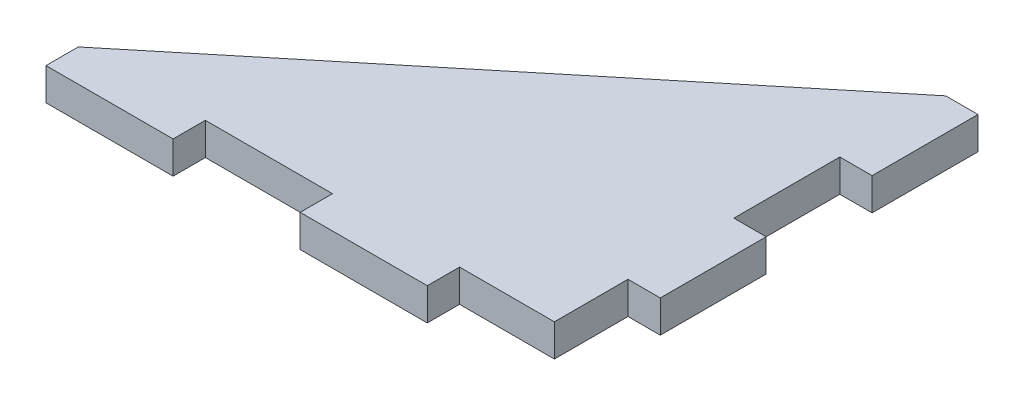
ISO-10303-21;
HEADER;
FILE_DESCRIPTION(('STEP AP214'),'2;1');
FILE_NAME('part.step','',(''),(''),'','','');
FILE_SCHEMA(('AUTOMOTIVE_DESIGN { 1 0 10303 214 1 1 1 1 }'));
ENDSEC;
DATA;
#1=APPLICATION_CONTEXT('core data for automotive mechanical design processes');
#2=APPLICATION_PROTOCOL_DEFINITION('international standard','automotive_design',2000,#1);
#3=PRODUCT_CONTEXT('',#1,'mechanical');
#4=PRODUCT('Part','Part','',(#3));
#5=PRODUCT_RELATED_PRODUCT_CATEGORY('part','',(#4));
#6=PRODUCT_DEFINITION_FORMATION('','',#4);
#7=PRODUCT_DEFINITION_CONTEXT('part definition',#1,'design');
#8=PRODUCT_DEFINITION('design','',#6,#7);
#9=PRODUCT_DEFINITION_SHAPE('','',#8);
#10=(LENGTH_UNIT() NAMED_UNIT(*) SI_UNIT(.MILLI.,.METRE.));
#11=(NAMED_UNIT(*) PLANE_ANGLE_UNIT() SI_UNIT($,.RADIAN.));
#12=(NAMED_UNIT(*) SI_UNIT($,.STERADIAN.) SOLID_ANGLE_UNIT());
#13=UNCERTAINTY_MEASURE_WITH_UNIT(LENGTH_MEASURE(1.E-05),#10,'distance_accuracy_value','');
#14=(GEOMETRIC_REPRESENTATION_CONTEXT(3) GLOBAL_UNCERTAINTY_ASSIGNED_CONTEXT((#13)) GLOBAL_UNIT_ASSIGNED_CONTEXT((#10,
#11,#12)) REPRESENTATION_CONTEXT('',''));
#15=CARTESIAN_POINT('',(0.,0.,0.));
#16=DIRECTION('',(0.,0.,1.));
#17=DIRECTION('',(1.,0.,0.));
#18=AXIS2_PLACEMENT_3D('',#15,#16,#17);
#19=CARTESIAN_POINT('',(0.,6.096,0.));
#20=DIRECTION('',(1.,0.,0.));
#21=DIRECTION('',(0.,0.,-1.));
#22=AXIS2_PLACEMENT_3D('',#19,#20,#21);
#23=PLANE('',#22);
#24=DIRECTION('',(0.,0.,1.));
#25=VECTOR('',#24,1.);
#26=CARTESIAN_POINT('',(0.,0.,0.));
#27=LINE('',#26,#25);
#28=CARTESIAN_POINT('',(0.,0.,-6.096));
#29=VERTEX_POINT('',#28);
#30=CARTESIAN_POINT('',(0.,0.,0.));
#31=VERTEX_POINT('',#30);
#32=EDGE_CURVE('E182',#29,#31,#27,.T.);
#33=ORIENTED_EDGE('',*,*,#32,.T.);
#34=DIRECTION('',(0.,-1.,0.));
#35=VECTOR('',#34,1.);
#36=CARTESIAN_POINT('',(0.,6.096,0.));
#37=LINE('',#36,#35);
#38=CARTESIAN_POINT('',(0.,6.096,0.));
#39=VERTEX_POINT('',#38);
#40=EDGE_CURVE('E11',#39,#31,#37,.T.);
#41=ORIENTED_EDGE('',*,*,#40,.F.);
#42=DIRECTION('',(0.,0.,1.));
#43=VECTOR('',#42,1.);
#44=CARTESIAN_POINT('',(0.,6.096,0.));
#45=LINE('',#44,#43);
#46=CARTESIAN_POINT('',(0.,6.096,-6.096));
#47=VERTEX_POINT('',#46);
#48=EDGE_CURVE('E214',#47,#39,#45,.T.);
#49=ORIENTED_EDGE('',*,*,#48,.F.);
#50=DIRECTION('',(0.,-1.,0.));
#51=VECTOR('',#50,1.);
#52=CARTESIAN_POINT('',(0.,6.096,-6.096));
#53=LINE('',#52,#51);
#54=EDGE_CURVE('E178',#47,#29,#53,.T.);
#55=ORIENTED_EDGE('',*,*,#54,.T.);
#56=EDGE_LOOP('',(#33,#41,#49,#55));
#57=FACE_BOUND('',#56,.T.);
#58=ADVANCED_FACE('F32',(#57),#23,.F.);
#59=CARTESIAN_POINT('',(0.,6.096,0.));
#60=DIRECTION('',(0.,0.,-1.));
#61=DIRECTION('',(-1.,0.,0.));
#62=AXIS2_PLACEMENT_3D('',#59,#60,#61);
#63=PLANE('',#62);
#64=DIRECTION('',(1.,0.,0.));
#65=VECTOR('',#64,1.);
#66=CARTESIAN_POINT('',(0.,0.,0.));
#67=LINE('',#66,#65);
#68=CARTESIAN_POINT('',(24.,0.,0.));
#69=VERTEX_POINT('',#68);
#70=EDGE_CURVE('E185',#31,#69,#67,.T.);
#71=ORIENTED_EDGE('',*,*,#70,.T.);
#72=DIRECTION('',(0.,-1.,0.));
#73=VECTOR('',#72,1.);
#74=CARTESIAN_POINT('',(24.,6.096,0.));
#75=LINE('',#74,#73);
#76=CARTESIAN_POINT('',(24.,6.096,0.));
#77=VERTEX_POINT('',#76);
#78=EDGE_CURVE('E40',#77,#69,#75,.T.);
#79=ORIENTED_EDGE('',*,*,#78,.F.);
#80=DIRECTION('',(1.,0.,0.));
#81=VECTOR('',#80,1.);
#82=CARTESIAN_POINT('',(0.,6.096,0.));
#83=LINE('',#82,#81);
#84=EDGE_CURVE('E118',#39,#77,#83,.T.);
#85=ORIENTED_EDGE('',*,*,#84,.F.);
#86=ORIENTED_EDGE('',*,*,#40,.T.);
#87=EDGE_LOOP('',(#71,#79,#85,#86));
#88=FACE_BOUND('',#87,.T.);
#89=ADVANCED_FACE('F317',(#88),#63,.F.);
#90=CARTESIAN_POINT('',(24.,6.096,0.));
#91=DIRECTION('',(-1.,0.,0.));
#92=DIRECTION('',(0.,0.,1.));
#93=AXIS2_PLACEMENT_3D('',#90,#91,#92);
#94=PLANE('',#93);
#95=DIRECTION('',(0.,0.,-1.));
#96=VECTOR('',#95,1.);
#97=CARTESIAN_POINT('',(24.,0.,0.));
#98=LINE('',#97,#96);
#99=CARTESIAN_POINT('',(24.,0.,-6.09600000000001));
#100=VERTEX_POINT('',#99);
#101=EDGE_CURVE('E187',#69,#100,#98,.T.);
#102=ORIENTED_EDGE('',*,*,#101,.T.);
#103=DIRECTION('',(0.,-1.,0.));
#104=VECTOR('',#103,1.);
#105=CARTESIAN_POINT('',(24.,6.096,-6.09600000000001));
#106=LINE('',#105,#104);
#107=CARTESIAN_POINT('',(24.,6.096,-6.09600000000001));
#108=VERTEX_POINT('',#107);
#109=EDGE_CURVE('E248',#108,#100,#106,.T.);
#110=ORIENTED_EDGE('',*,*,#109,.F.);
#111=DIRECTION('',(0.,0.,-1.));
#112=VECTOR('',#111,1.);
#113=CARTESIAN_POINT('',(24.,6.096,0.));
#114=LINE('',#113,#112);
#115=EDGE_CURVE('E256',#77,#108,#114,.T.);
#116=ORIENTED_EDGE('',*,*,#115,.F.);
#117=ORIENTED_EDGE('',*,*,#78,.T.);
#118=EDGE_LOOP('',(#102,#110,#116,#117));
#119=FACE_BOUND('',#118,.T.);
#120=ADVANCED_FACE('F254',(#119),#94,.F.);
#121=CARTESIAN_POINT('',(24.,6.096,-6.09600000000001));
#122=DIRECTION('',(0.,0.,-1.));
#123=DIRECTION('',(-1.,0.,0.));
#124=AXIS2_PLACEMENT_3D('',#121,#122,#123);
#125=PLANE('',#124);
#126=DIRECTION('',(1.,0.,0.));
#127=VECTOR('',#126,1.);
#128=CARTESIAN_POINT('',(24.,0.,-6.09600000000001));
#129=LINE('',#128,#127);
#130=CARTESIAN_POINT('',(48.,0.,-6.09600000000001));
#131=VERTEX_POINT('',#130);
#132=EDGE_CURVE('E189',#100,#131,#129,.T.);
#133=ORIENTED_EDGE('',*,*,#132,.T.);
#134=DIRECTION('',(0.,-1.,0.));
#135=VECTOR('',#134,1.);
#136=CARTESIAN_POINT('',(48.,6.096,-6.09600000000001));
#137=LINE('',#136,#135);
#138=CARTESIAN_POINT('',(48.,6.096,-6.09600000000001));
#139=VERTEX_POINT('',#138);
#140=EDGE_CURVE('E245',#139,#131,#137,.T.);
#141=ORIENTED_EDGE('',*,*,#140,.F.);
#142=DIRECTION('',(1.,0.,0.));
#143=VECTOR('',#142,1.);
#144=CARTESIAN_POINT('',(24.,6.096,-6.09600000000001));
#145=LINE('',#144,#143);
#146=EDGE_CURVE('E274',#108,#139,#145,.T.);
#147=ORIENTED_EDGE('',*,*,#146,.F.);
#148=ORIENTED_EDGE('',*,*,#109,.T.);
#149=EDGE_LOOP('',(#133,#141,#147,#148));
#150=FACE_BOUND('',#149,.T.);
#151=ADVANCED_FACE('F265',(#150),#125,.F.);
#152=CARTESIAN_POINT('',(48.,6.096,-6.09600000000001));
#153=DIRECTION('',(1.,0.,0.));
#154=DIRECTION('',(0.,0.,-1.));
#155=AXIS2_PLACEMENT_3D('',#152,#153,#154);
#156=PLANE('',#155);
#157=DIRECTION('',(0.,0.,1.));
#158=VECTOR('',#157,1.);
#159=CARTESIAN_POINT('',(48.,0.,-6.09600000000001));
#160=LINE('',#159,#158);
#161=CARTESIAN_POINT('',(48.,0.,0.));
#162=VERTEX_POINT('',#161);
#163=EDGE_CURVE('E191',#131,#162,#160,.T.);
#164=ORIENTED_EDGE('',*,*,#163,.T.);
#165=DIRECTION('',(0.,-1.,0.));
#166=VECTOR('',#165,1.);
#167=CARTESIAN_POINT('',(48.,6.096,0.));
#168=LINE('',#167,#166);
#169=CARTESIAN_POINT('',(48.,6.096,0.));
#170=VERTEX_POINT('',#169);
#171=EDGE_CURVE('E242',#170,#162,#168,.T.);
#172=ORIENTED_EDGE('',*,*,#171,.F.);
#173=DIRECTION('',(0.,0.,1.));
#174=VECTOR('',#173,1.);
#175=CARTESIAN_POINT('',(48.,6.096,-6.09600000000001));
#176=LINE('',#175,#174);
#177=EDGE_CURVE('E271',#139,#170,#176,.T.);
#178=ORIENTED_EDGE('',*,*,#177,.F.);
#179=ORIENTED_EDGE('',*,*,#140,.T.);
#180=EDGE_LOOP('',(#164,#172,#178,#179));
#181=FACE_BOUND('',#180,.T.);
#182=ADVANCED_FACE('F269',(#181),#156,.F.);
#183=CARTESIAN_POINT('',(48.,6.096,0.));
#184=DIRECTION('',(0.,0.,-1.));
#185=DIRECTION('',(-1.,0.,0.));
#186=AXIS2_PLACEMENT_3D('',#183,#184,#185);
#187=PLANE('',#186);
#188=DIRECTION('',(1.,0.,0.));
#189=VECTOR('',#188,1.);
#190=CARTESIAN_POINT('',(48.,0.,0.));
#191=LINE('',#190,#189);
#192=CARTESIAN_POINT('',(72.,0.,0.));
#193=VERTEX_POINT('',#192);
#194=EDGE_CURVE('E193',#162,#193,#191,.T.);
#195=ORIENTED_EDGE('',*,*,#194,.T.);
#196=DIRECTION('',(0.,-1.,0.));
#197=VECTOR('',#196,1.);
#198=CARTESIAN_POINT('',(72.,6.096,0.));
#199=LINE('',#198,#197);
#200=CARTESIAN_POINT('',(72.,6.096,0.));
#201=VERTEX_POINT('',#200);
#202=EDGE_CURVE('E239',#201,#193,#199,.T.);
#203=ORIENTED_EDGE('',*,*,#202,.F.);
#204=DIRECTION('',(1.,0.,0.));
#205=VECTOR('',#204,1.);
#206=CARTESIAN_POINT('',(48.,6.096,0.));
#207=LINE('',#206,#205);
#208=EDGE_CURVE('E273',#170,#201,#207,.T.);
#209=ORIENTED_EDGE('',*,*,#208,.F.);
#210=ORIENTED_EDGE('',*,*,#171,.T.);
#211=EDGE_LOOP('',(#195,#203,#209,#210));
#212=FACE_BOUND('',#211,.T.);
#213=ADVANCED_FACE('F330',(#212),#187,.F.);
#214=CARTESIAN_POINT('',(72.,6.096,0.));
#215=DIRECTION('',(-1.,0.,0.));
#216=DIRECTION('',(0.,0.,1.));
#217=AXIS2_PLACEMENT_3D('',#214,#215,#216);
#218=PLANE('',#217);
#219=DIRECTION('',(0.,0.,-1.));
#220=VECTOR('',#219,1.);
#221=CARTESIAN_POINT('',(72.,0.,0.));
#222=LINE('',#221,#220);
#223=CARTESIAN_POINT('',(72.,0.,-6.09600000000001));
#224=VERTEX_POINT('',#223);
#225=EDGE_CURVE('E195',#193,#224,#222,.T.);
#226=ORIENTED_EDGE('',*,*,#225,.T.);
#227=DIRECTION('',(0.,-1.,0.));
#228=VECTOR('',#227,1.);
#229=CARTESIAN_POINT('',(72.,6.096,-6.09600000000001));
#230=LINE('',#229,#228);
#231=CARTESIAN_POINT('',(72.,6.096,-6.09600000000001));
#232=VERTEX_POINT('',#231);
#233=EDGE_CURVE('E236',#232,#224,#230,.T.);
#234=ORIENTED_EDGE('',*,*,#233,.F.);
#235=DIRECTION('',(0.,0.,-1.));
#236=VECTOR('',#235,1.);
#237=CARTESIAN_POINT('',(72.,6.096,0.));
#238=LINE('',#237,#236);
#239=EDGE_CURVE('E276',#201,#232,#238,.T.);
#240=ORIENTED_EDGE('',*,*,#239,.F.);
#241=ORIENTED_EDGE('',*,*,#202,.T.);
#242=EDGE_LOOP('',(#226,#234,#240,#241));
#243=FACE_BOUND('',#242,.T.);
#244=ADVANCED_FACE('F333',(#243),#218,.F.);
#245=CARTESIAN_POINT('',(72.,6.096,-6.09600000000001));
#246=DIRECTION('',(0.,0.,-1.));
#247=DIRECTION('',(-1.,0.,0.));
#248=AXIS2_PLACEMENT_3D('',#245,#246,#247);
#249=PLANE('',#248);
#250=DIRECTION('',(1.,0.,0.));
#251=VECTOR('',#250,1.);
#252=CARTESIAN_POINT('',(72.,0.,-6.09600000000001));
#253=LINE('',#252,#251);
#254=CARTESIAN_POINT('',(89.904,0.,-6.09600000000001));
#255=VERTEX_POINT('',#254);
#256=EDGE_CURVE('E197',#224,#255,#253,.T.);
#257=ORIENTED_EDGE('',*,*,#256,.T.);
#258=DIRECTION('',(0.,-1.,0.));
#259=VECTOR('',#258,1.);
#260=CARTESIAN_POINT('',(89.904,6.096,-6.09600000000001));
#261=LINE('',#260,#259);
#262=CARTESIAN_POINT('',(89.904,6.096,-6.09600000000001));
#263=VERTEX_POINT('',#262);
#264=EDGE_CURVE('E233',#263,#255,#261,.T.);
#265=ORIENTED_EDGE('',*,*,#264,.F.);
#266=DIRECTION('',(1.,0.,0.));
#267=VECTOR('',#266,1.);
#268=CARTESIAN_POINT('',(72.,6.096,-6.09600000000001));
#269=LINE('',#268,#267);
#270=EDGE_CURVE('E282',#232,#263,#269,.T.);
#271=ORIENTED_EDGE('',*,*,#270,.F.);
#272=ORIENTED_EDGE('',*,*,#233,.T.);
#273=EDGE_LOOP('',(#257,#265,#271,#272));
#274=FACE_BOUND('',#273,.T.);
#275=ADVANCED_FACE('F337',(#274),#249,.F.);
#276=CARTESIAN_POINT('',(89.904,6.096,-20.));
#277=DIRECTION('',(-1.,0.,0.));
#278=DIRECTION('',(0.,0.,1.));
#279=AXIS2_PLACEMENT_3D('',#276,#277,#278);
#280=PLANE('',#279);
#281=DIRECTION('',(0.,0.,-1.));
#282=VECTOR('',#281,1.);
#283=CARTESIAN_POINT('',(89.904,0.,-20.));
#284=LINE('',#283,#282);
#285=CARTESIAN_POINT('',(89.904,0.,-20.));
#286=VERTEX_POINT('',#285);
#287=EDGE_CURVE('E199',#255,#286,#284,.T.);
#288=ORIENTED_EDGE('',*,*,#287,.T.);
#289=DIRECTION('',(0.,-1.,0.));
#290=VECTOR('',#289,1.);
#291=CARTESIAN_POINT('',(89.904,6.096,-20.));
#292=LINE('',#291,#290);
#293=CARTESIAN_POINT('',(89.904,6.096,-20.));
#294=VERTEX_POINT('',#293);
#295=EDGE_CURVE('E230',#294,#286,#292,.T.);
#296=ORIENTED_EDGE('',*,*,#295,.F.);
#297=DIRECTION('',(0.,0.,-1.));
#298=VECTOR('',#297,1.);
#299=CARTESIAN_POINT('',(89.904,6.096,-20.));
#300=LINE('',#299,#298);
#301=EDGE_CURVE('E284',#263,#294,#300,.T.);
#302=ORIENTED_EDGE('',*,*,#301,.F.);
#303=ORIENTED_EDGE('',*,*,#264,.T.);
#304=EDGE_LOOP('',(#288,#296,#302,#303));
#305=FACE_BOUND('',#304,.T.);
#306=ADVANCED_FACE('F341',(#305),#280,.F.);
#307=CARTESIAN_POINT('',(96.,6.096,-20.));
#308=DIRECTION('',(0.,0.,-1.));
#309=DIRECTION('',(-1.,0.,0.));
#310=AXIS2_PLACEMENT_3D('',#307,#308,#309);
#311=PLANE('',#310);
#312=DIRECTION('',(1.,0.,0.));
#313=VECTOR('',#312,1.);
#314=CARTESIAN_POINT('',(96.,0.,-20.));
#315=LINE('',#314,#313);
#316=CARTESIAN_POINT('',(96.,0.,-20.));
#317=VERTEX_POINT('',#316);
#318=EDGE_CURVE('E201',#286,#317,#315,.T.);
#319=ORIENTED_EDGE('',*,*,#318,.T.);
#320=DIRECTION('',(0.,-1.,0.));
#321=VECTOR('',#320,1.);
#322=CARTESIAN_POINT('',(96.,6.096,-20.));
#323=LINE('',#322,#321);
#324=CARTESIAN_POINT('',(96.,6.096,-20.));
#325=VERTEX_POINT('',#324);
#326=EDGE_CURVE('E227',#325,#317,#323,.T.);
#327=ORIENTED_EDGE('',*,*,#326,.F.);
#328=DIRECTION('',(1.,0.,0.));
#329=VECTOR('',#328,1.);
#330=CARTESIAN_POINT('',(96.,6.096,-20.));
#331=LINE('',#330,#329);
#332=EDGE_CURVE('E286',#294,#325,#331,.T.);
#333=ORIENTED_EDGE('',*,*,#332,.F.);
#334=ORIENTED_EDGE('',*,*,#295,.T.);
#335=EDGE_LOOP('',(#319,#327,#333,#334));
#336=FACE_BOUND('',#335,.T.);
#337=ADVANCED_FACE('F345',(#336),#311,.F.);
#338=CARTESIAN_POINT('',(96.,6.096,-20.));
#339=DIRECTION('',(-1.,0.,0.));
#340=DIRECTION('',(0.,0.,1.));
#341=AXIS2_PLACEMENT_3D('',#338,#339,#340);
#342=PLANE('',#341);
#343=DIRECTION('',(0.,0.,-1.));
#344=VECTOR('',#343,1.);
#345=CARTESIAN_POINT('',(96.,0.,-20.));
#346=LINE('',#345,#344);
#347=CARTESIAN_POINT('',(96.,0.,-40.));
#348=VERTEX_POINT('',#347);
#349=EDGE_CURVE('E203',#317,#348,#346,.T.);
#350=ORIENTED_EDGE('',*,*,#349,.T.);
#351=DIRECTION('',(0.,-1.,0.));
#352=VECTOR('',#351,1.);
#353=CARTESIAN_POINT('',(96.,6.096,-40.));
#354=LINE('',#353,#352);
#355=CARTESIAN_POINT('',(96.,6.096,-40.));
#356=VERTEX_POINT('',#355);
#357=EDGE_CURVE('E224',#356,#348,#354,.T.);
#358=ORIENTED_EDGE('',*,*,#357,.F.);
#359=DIRECTION('',(0.,0.,-1.));
#360=VECTOR('',#359,1.);
#361=CARTESIAN_POINT('',(96.,6.096,-20.));
#362=LINE('',#361,#360);
#363=EDGE_CURVE('E288',#325,#356,#362,.T.);
#364=ORIENTED_EDGE('',*,*,#363,.F.);
#365=ORIENTED_EDGE('',*,*,#326,.T.);
#366=EDGE_LOOP('',(#350,#358,#364,#365));
#367=FACE_BOUND('',#366,.T.);
#368=ADVANCED_FACE('F349',(#367),#342,.F.);
#369=CARTESIAN_POINT('',(89.904,6.096,-40.));
#370=DIRECTION('',(0.,0.,1.));
#371=DIRECTION('',(1.,0.,0.));
#372=AXIS2_PLACEMENT_3D('',#369,#370,#371);
#373=PLANE('',#372);
#374=DIRECTION('',(-1.,0.,0.));
#375=VECTOR('',#374,1.);
#376=CARTESIAN_POINT('',(89.904,0.,-40.));
#377=LINE('',#376,#375);
#378=CARTESIAN_POINT('',(89.904,0.,-40.));
#379=VERTEX_POINT('',#378);
#380=EDGE_CURVE('E205',#348,#379,#377,.T.);
#381=ORIENTED_EDGE('',*,*,#380,.T.);
#382=DIRECTION('',(0.,-1.,0.));
#383=VECTOR('',#382,1.);
#384=CARTESIAN_POINT('',(89.904,6.096,-40.));
#385=LINE('',#384,#383);
#386=CARTESIAN_POINT('',(89.904,6.096,-40.));
#387=VERTEX_POINT('',#386);
#388=EDGE_CURVE('E221',#387,#379,#385,.T.);
#389=ORIENTED_EDGE('',*,*,#388,.F.);
#390=DIRECTION('',(-1.,0.,0.));
#391=VECTOR('',#390,1.);
#392=CARTESIAN_POINT('',(89.904,6.096,-40.));
#393=LINE('',#392,#391);
#394=EDGE_CURVE('E290',#356,#387,#393,.T.);
#395=ORIENTED_EDGE('',*,*,#394,.F.);
#396=ORIENTED_EDGE('',*,*,#357,.T.);
#397=EDGE_LOOP('',(#381,#389,#395,#396));
#398=FACE_BOUND('',#397,.T.);
#399=ADVANCED_FACE('F353',(#398),#373,.F.);
#400=CARTESIAN_POINT('',(89.904,6.096,-60.));
#401=DIRECTION('',(-1.,0.,0.));
#402=DIRECTION('',(0.,0.,1.));
#403=AXIS2_PLACEMENT_3D('',#400,#401,#402);
#404=PLANE('',#403);
#405=DIRECTION('',(0.,0.,-1.));
#406=VECTOR('',#405,1.);
#407=CARTESIAN_POINT('',(89.904,0.,-60.));
#408=LINE('',#407,#406);
#409=CARTESIAN_POINT('',(89.904,0.,-60.));
#410=VERTEX_POINT('',#409);
#411=EDGE_CURVE('E207',#379,#410,#408,.T.);
#412=ORIENTED_EDGE('',*,*,#411,.T.);
#413=DIRECTION('',(0.,-1.,0.));
#414=VECTOR('',#413,1.);
#415=CARTESIAN_POINT('',(89.904,6.096,-60.));
#416=LINE('',#415,#414);
#417=CARTESIAN_POINT('',(89.904,6.096,-60.));
#418=VERTEX_POINT('',#417);
#419=EDGE_CURVE('E218',#418,#410,#416,.T.);
#420=ORIENTED_EDGE('',*,*,#419,.F.);
#421=DIRECTION('',(0.,0.,-1.));
#422=VECTOR('',#421,1.);
#423=CARTESIAN_POINT('',(89.904,6.096,-60.));
#424=LINE('',#423,#422);
#425=EDGE_CURVE('E292',#387,#418,#424,.T.);
#426=ORIENTED_EDGE('',*,*,#425,.F.);
#427=ORIENTED_EDGE('',*,*,#388,.T.);
#428=EDGE_LOOP('',(#412,#420,#426,#427));
#429=FACE_BOUND('',#428,.T.);
#430=ADVANCED_FACE('F298',(#429),#404,.F.);
#431=CARTESIAN_POINT('',(96.,6.096,-60.));
#432=DIRECTION('',(0.,0.,-1.));
#433=DIRECTION('',(-1.,0.,0.));
#434=AXIS2_PLACEMENT_3D('',#431,#432,#433);
#435=PLANE('',#434);
#436=DIRECTION('',(1.,0.,0.));
#437=VECTOR('',#436,1.);
#438=CARTESIAN_POINT('',(96.,0.,-60.));
#439=LINE('',#438,#437);
#440=CARTESIAN_POINT('',(96.,0.,-60.));
#441=VERTEX_POINT('',#440);
#442=EDGE_CURVE('E209',#410,#441,#439,.T.);
#443=ORIENTED_EDGE('',*,*,#442,.T.);
#444=DIRECTION('',(0.,-1.,0.));
#445=VECTOR('',#444,1.);
#446=CARTESIAN_POINT('',(96.,6.096,-60.));
#447=LINE('',#446,#445);
#448=CARTESIAN_POINT('',(96.,6.096,-60.));
#449=VERTEX_POINT('',#448);
#450=EDGE_CURVE('E173',#449,#441,#447,.T.);
#451=ORIENTED_EDGE('',*,*,#450,.F.);
#452=DIRECTION('',(1.,0.,0.));
#453=VECTOR('',#452,1.);
#454=CARTESIAN_POINT('',(96.,6.096,-60.));
#455=LINE('',#454,#453);
#456=EDGE_CURVE('E164',#418,#449,#455,.T.);
#457=ORIENTED_EDGE('',*,*,#456,.F.);
#458=ORIENTED_EDGE('',*,*,#419,.T.);
#459=EDGE_LOOP('',(#443,#451,#457,#458));
#460=FACE_BOUND('',#459,.T.);
#461=ADVANCED_FACE('F302',(#460),#435,.F.);
#462=CARTESIAN_POINT('',(96.,6.096,-60.));
#463=DIRECTION('',(-1.,0.,0.));
#464=DIRECTION('',(0.,0.,1.));
#465=AXIS2_PLACEMENT_3D('',#462,#463,#464);
#466=PLANE('',#465);
#467=DIRECTION('',(0.,0.,-1.));
#468=VECTOR('',#467,1.);
#469=CARTESIAN_POINT('',(96.,0.,-60.));
#470=LINE('',#469,#468);
#471=CARTESIAN_POINT('',(96.,0.,-80.));
#472=VERTEX_POINT('',#471);
#473=EDGE_CURVE('E172',#441,#472,#470,.T.);
#474=ORIENTED_EDGE('',*,*,#473,.T.);
#475=DIRECTION('',(0.,-1.,0.));
#476=VECTOR('',#475,1.);
#477=CARTESIAN_POINT('',(96.,6.096,-80.));
#478=LINE('',#477,#476);
#479=CARTESIAN_POINT('',(96.,6.096,-80.));
#480=VERTEX_POINT('',#479);
#481=EDGE_CURVE('E169',#480,#472,#478,.T.);
#482=ORIENTED_EDGE('',*,*,#481,.F.);
#483=DIRECTION('',(0.,0.,-1.));
#484=VECTOR('',#483,1.);
#485=CARTESIAN_POINT('',(96.,6.096,-60.));
#486=LINE('',#485,#484);
#487=EDGE_CURVE('E158',#449,#480,#486,.T.);
#488=ORIENTED_EDGE('',*,*,#487,.F.);
#489=ORIENTED_EDGE('',*,*,#450,.T.);
#490=EDGE_LOOP('',(#474,#482,#488,#489));
#491=FACE_BOUND('',#490,.T.);
#492=ADVANCED_FACE('F170',(#491),#466,.F.);
#493=CARTESIAN_POINT('',(96.,6.096,-80.));
#494=DIRECTION('',(0.,0.,1.));
#495=DIRECTION('',(1.,0.,0.));
#496=AXIS2_PLACEMENT_3D('',#493,#494,#495);
#497=PLANE('',#496);
#498=DIRECTION('',(-1.,0.,0.));
#499=VECTOR('',#498,1.);
#500=CARTESIAN_POINT('',(96.,0.,-80.));
#501=LINE('',#500,#499);
#502=CARTESIAN_POINT('',(89.904,0.,-80.));
#503=VERTEX_POINT('',#502);
#504=EDGE_CURVE('E104',#472,#503,#501,.T.);
#505=ORIENTED_EDGE('',*,*,#504,.T.);
#506=DIRECTION('',(0.,-1.,0.));
#507=VECTOR('',#506,1.);
#508=CARTESIAN_POINT('',(89.904,6.096,-80.));
#509=LINE('',#508,#507);
#510=CARTESIAN_POINT('',(89.904,6.096,-80.));
#511=VERTEX_POINT('',#510);
#512=EDGE_CURVE('E174',#511,#503,#509,.T.);
#513=ORIENTED_EDGE('',*,*,#512,.F.);
#514=DIRECTION('',(-1.,0.,0.));
#515=VECTOR('',#514,1.);
#516=CARTESIAN_POINT('',(96.,6.096,-80.));
#517=LINE('',#516,#515);
#518=EDGE_CURVE('E162',#480,#511,#517,.T.);
#519=ORIENTED_EDGE('',*,*,#518,.F.);
#520=ORIENTED_EDGE('',*,*,#481,.T.);
#521=EDGE_LOOP('',(#505,#513,#519,#520));
#522=FACE_BOUND('',#521,.T.);
#523=ADVANCED_FACE('F176',(#522),#497,.F.);
#524=CARTESIAN_POINT('',(0.,6.096,-6.096));
#525=DIRECTION('',(0.635017901186295,0.,0.772497420819612));
#526=DIRECTION('',(0.772497420819612,0.,-0.635017901186295));
#527=AXIS2_PLACEMENT_3D('',#524,#525,#526);
#528=PLANE('',#527);
#529=DIRECTION('',(-0.772497420819612,0.,0.635017901186295));
#530=VECTOR('',#529,1.);
#531=CARTESIAN_POINT('',(0.,0.,-6.096));
#532=LINE('',#531,#530);
#533=EDGE_CURVE('E110',#503,#29,#532,.T.);
#534=ORIENTED_EDGE('',*,*,#533,.T.);
#535=ORIENTED_EDGE('',*,*,#54,.F.);
#536=DIRECTION('',(-0.772497420819612,0.,0.635017901186295));
#537=VECTOR('',#536,1.);
#538=CARTESIAN_POINT('',(0.,6.096,-6.096));
#539=LINE('',#538,#537);
#540=EDGE_CURVE('E48',#511,#47,#539,.T.);
#541=ORIENTED_EDGE('',*,*,#540,.F.);
#542=ORIENTED_EDGE('',*,*,#512,.T.);
#543=EDGE_LOOP('',(#534,#535,#541,#542));
#544=FACE_BOUND('',#543,.T.);
#545=ADVANCED_FACE('F306',(#544),#528,.F.);
#546=CARTESIAN_POINT('',(0.,6.096,0.));
#547=DIRECTION('',(0.,1.,0.));
#548=DIRECTION('',(0.,0.,1.));
#549=AXIS2_PLACEMENT_3D('',#546,#547,#548);
#550=PLANE('',#549);
#551=ORIENTED_EDGE('',*,*,#48,.T.);
#552=ORIENTED_EDGE('',*,*,#84,.T.);
#553=ORIENTED_EDGE('',*,*,#115,.T.);
#554=ORIENTED_EDGE('',*,*,#146,.T.);
#555=ORIENTED_EDGE('',*,*,#177,.T.);
#556=ORIENTED_EDGE('',*,*,#208,.T.);
#557=ORIENTED_EDGE('',*,*,#239,.T.);
#558=ORIENTED_EDGE('',*,*,#270,.T.);
#559=ORIENTED_EDGE('',*,*,#301,.T.);
#560=ORIENTED_EDGE('',*,*,#332,.T.);
#561=ORIENTED_EDGE('',*,*,#363,.T.);
#562=ORIENTED_EDGE('',*,*,#394,.T.);
#563=ORIENTED_EDGE('',*,*,#425,.T.);
#564=ORIENTED_EDGE('',*,*,#456,.T.);
#565=ORIENTED_EDGE('',*,*,#487,.T.);
#566=ORIENTED_EDGE('',*,*,#518,.T.);
#567=ORIENTED_EDGE('',*,*,#540,.T.);
#568=EDGE_LOOP('',(#551,#552,#553,#554,#555,#556,#557,#558,#559,#560,#561,#562,#563,#564,#565,
#566,#567));
#569=FACE_BOUND('',#568,.T.);
#570=ADVANCED_FACE('F160',(#569),#550,.T.);
#571=CARTESIAN_POINT('',(0.,0.,0.));
#572=DIRECTION('',(0.,1.,0.));
#573=DIRECTION('',(0.,0.,1.));
#574=AXIS2_PLACEMENT_3D('',#571,#572,#573);
#575=PLANE('',#574);
#576=ORIENTED_EDGE('',*,*,#32,.F.);
#577=ORIENTED_EDGE('',*,*,#533,.F.);
#578=ORIENTED_EDGE('',*,*,#504,.F.);
#579=ORIENTED_EDGE('',*,*,#473,.F.);
#580=ORIENTED_EDGE('',*,*,#442,.F.);
#581=ORIENTED_EDGE('',*,*,#411,.F.);
#582=ORIENTED_EDGE('',*,*,#380,.F.);
#583=ORIENTED_EDGE('',*,*,#349,.F.);
#584=ORIENTED_EDGE('',*,*,#318,.F.);
#585=ORIENTED_EDGE('',*,*,#287,.F.);
#586=ORIENTED_EDGE('',*,*,#256,.F.);
#587=ORIENTED_EDGE('',*,*,#225,.F.);
#588=ORIENTED_EDGE('',*,*,#194,.F.);
#589=ORIENTED_EDGE('',*,*,#163,.F.);
#590=ORIENTED_EDGE('',*,*,#132,.F.);
#591=ORIENTED_EDGE('',*,*,#101,.F.);
#592=ORIENTED_EDGE('',*,*,#70,.F.);
#593=EDGE_LOOP('',(#576,#577,#578,#579,#580,#581,#582,#583,#584,#585,#586,#587,#588,#589,#590,
#591,#592));
#594=FACE_BOUND('',#593,.T.);
#595=ADVANCED_FACE('F260',(#594),#575,.F.);
#596=CLOSED_SHELL('',(#58,#89,#120,#151,#182,#213,#244,#275,#306,#337,#368,#399,#430,#461,#492,
#523,#545,#570,#595));
#597=MANIFOLD_SOLID_BREP('B2',#596);
#598=ADVANCED_BREP_SHAPE_REPRESENTATION('',(#18,#597),#14);
#599=SHAPE_DEFINITION_REPRESENTATION(#9,#598);
ENDSEC;
END-ISO-10303-21;
